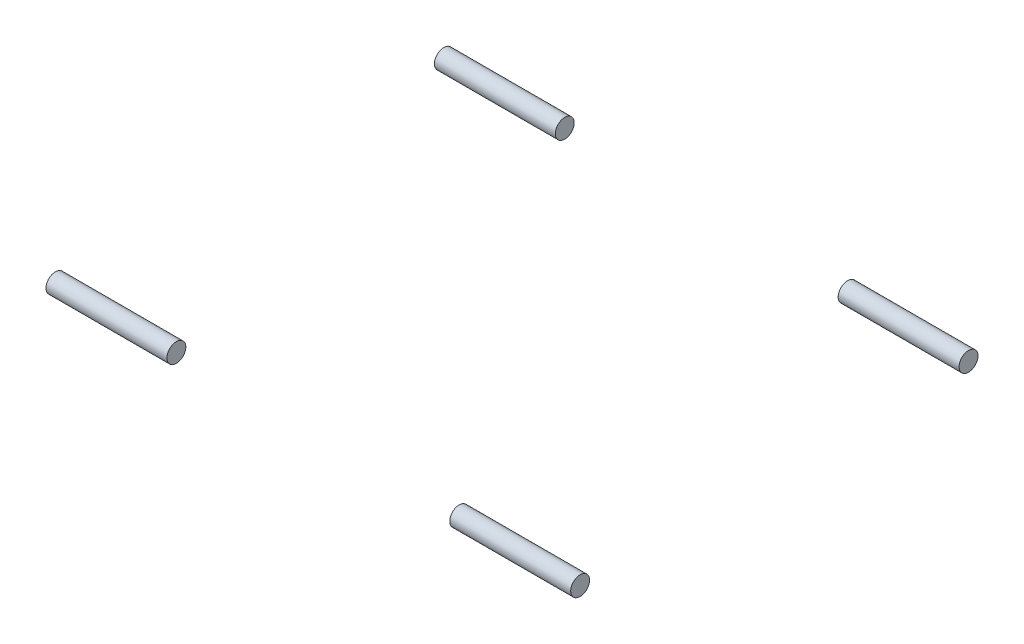
ISO-10303-21;
HEADER;
FILE_DESCRIPTION(('STEP AP214'),'2;1');
FILE_NAME('part.step','',(''),(''),'','','');
FILE_SCHEMA(('AUTOMOTIVE_DESIGN { 1 0 10303 214 1 1 1 1 }'));
ENDSEC;
DATA;
#1=APPLICATION_CONTEXT('core data for automotive mechanical design processes');
#2=APPLICATION_PROTOCOL_DEFINITION('international standard','automotive_design',2000,#1);
#3=PRODUCT_CONTEXT('',#1,'mechanical');
#4=PRODUCT('Part','Part','',(#3));
#5=PRODUCT_RELATED_PRODUCT_CATEGORY('part','',(#4));
#6=PRODUCT_DEFINITION_FORMATION('','',#4);
#7=PRODUCT_DEFINITION_CONTEXT('part definition',#1,'design');
#8=PRODUCT_DEFINITION('design','',#6,#7);
#9=PRODUCT_DEFINITION_SHAPE('','',#8);
#10=(LENGTH_UNIT() NAMED_UNIT(*) SI_UNIT(.MILLI.,.METRE.));
#11=(NAMED_UNIT(*) PLANE_ANGLE_UNIT() SI_UNIT($,.RADIAN.));
#12=(NAMED_UNIT(*) SI_UNIT($,.STERADIAN.) SOLID_ANGLE_UNIT());
#13=UNCERTAINTY_MEASURE_WITH_UNIT(LENGTH_MEASURE(1.E-05),#10,'distance_accuracy_value','');
#14=(GEOMETRIC_REPRESENTATION_CONTEXT(3) GLOBAL_UNCERTAINTY_ASSIGNED_CONTEXT((#13)) GLOBAL_UNIT_ASSIGNED_CONTEXT((#10,
#11,#12)) REPRESENTATION_CONTEXT('',''));
#15=CARTESIAN_POINT('',(0.,0.,0.));
#16=DIRECTION('',(0.,0.,1.));
#17=DIRECTION('',(1.,0.,0.));
#18=AXIS2_PLACEMENT_3D('',#15,#16,#17);
#19=CARTESIAN_POINT('',(-88.1500000000001,0.,0.));
#20=DIRECTION('',(1.,0.,0.));
#21=DIRECTION('',(0.,0.,1.));
#22=AXIS2_PLACEMENT_3D('',#19,#20,#21);
#23=PLANE('',#22);
#24=CARTESIAN_POINT('',(-88.1500000000001,0.,0.));
#25=DIRECTION('',(-1.,0.,0.));
#26=DIRECTION('',(0.,0.,1.));
#27=AXIS2_PLACEMENT_3D('',#24,#25,#26);
#28=CIRCLE('',#27,3.175);
#29=CARTESIAN_POINT('',(-88.1500000000001,0.,-3.175));
#30=VERTEX_POINT('',#29);
#31=EDGE_CURVE('E11',#30,#30,#28,.T.);
#32=ORIENTED_EDGE('',*,*,#31,.T.);
#33=EDGE_LOOP('',(#32));
#34=FACE_BOUND('',#33,.T.);
#35=ADVANCED_FACE('F46',(#34),#23,.F.);
#36=CARTESIAN_POINT('',(-38.5297438309309,0.,0.));
#37=DIRECTION('',(-1.,0.,0.));
#38=DIRECTION('',(0.,0.,-1.));
#39=AXIS2_PLACEMENT_3D('',#36,#37,#38);
#40=CYLINDRICAL_SURFACE('',#39,3.175);
#41=CARTESIAN_POINT('',(-47.509999952,0.,0.));
#42=DIRECTION('',(1.,0.,0.));
#43=DIRECTION('',(0.,0.,-1.));
#44=AXIS2_PLACEMENT_3D('',#41,#42,#43);
#45=CIRCLE('',#44,3.175);
#46=CARTESIAN_POINT('',(-47.509999952,0.,-3.175));
#47=VERTEX_POINT('',#46);
#48=EDGE_CURVE('E50',#47,#47,#45,.F.);
#49=CARTESIAN_POINT('',(-47.509999952,0.,-3.175));
#50=CARTESIAN_POINT('',(-47.9333332858334,0.,-3.175));
#51=CARTESIAN_POINT('',(-48.3566666196667,0.,-3.175));
#52=CARTESIAN_POINT('',(-49.2033332873334,0.,-3.175));
#53=CARTESIAN_POINT('',(-49.6266666211667,0.,-3.175));
#54=CARTESIAN_POINT('',(-50.4733332888334,0.,-3.175));
#55=CARTESIAN_POINT('',(-50.8966666226667,0.,-3.175));
#56=CARTESIAN_POINT('',(-51.7433332903334,0.,-3.175));
#57=CARTESIAN_POINT('',(-52.1666666241667,0.,-3.175));
#58=CARTESIAN_POINT('',(-53.0133332918334,0.,-3.175));
#59=CARTESIAN_POINT('',(-53.4366666256667,0.,-3.175));
#60=CARTESIAN_POINT('',(-54.2833332933334,0.,-3.175));
#61=CARTESIAN_POINT('',(-54.7066666271667,0.,-3.175));
#62=CARTESIAN_POINT('',(-55.5533332948334,0.,-3.175));
#63=CARTESIAN_POINT('',(-55.9766666286667,0.,-3.175));
#64=CARTESIAN_POINT('',(-56.8233332963334,0.,-3.175));
#65=CARTESIAN_POINT('',(-57.2466666301667,0.,-3.175));
#66=CARTESIAN_POINT('',(-58.0933332978334,0.,-3.175));
#67=CARTESIAN_POINT('',(-58.5166666316667,0.,-3.175));
#68=CARTESIAN_POINT('',(-59.3633332993334,0.,-3.175));
#69=CARTESIAN_POINT('',(-59.7866666331667,0.,-3.175));
#70=CARTESIAN_POINT('',(-60.6333333008334,0.,-3.175));
#71=CARTESIAN_POINT('',(-61.0566666346667,0.,-3.175));
#72=CARTESIAN_POINT('',(-61.9033333023334,0.,-3.175));
#73=CARTESIAN_POINT('',(-62.3266666361667,0.,-3.175));
#74=CARTESIAN_POINT('',(-63.1733333038334,0.,-3.175));
#75=CARTESIAN_POINT('',(-63.5966666376668,0.,-3.175));
#76=CARTESIAN_POINT('',(-64.4433333053334,0.,-3.175));
#77=CARTESIAN_POINT('',(-64.8666666391668,0.,-3.175));
#78=CARTESIAN_POINT('',(-65.7133333068334,0.,-3.175));
#79=CARTESIAN_POINT('',(-66.1366666406667,0.,-3.175));
#80=CARTESIAN_POINT('',(-66.9833333083334,0.,-3.175));
#81=CARTESIAN_POINT('',(-67.4066666421668,0.,-3.175));
#82=CARTESIAN_POINT('',(-68.2533333098334,0.,-3.175));
#83=CARTESIAN_POINT('',(-68.6766666436667,0.,-3.175));
#84=CARTESIAN_POINT('',(-69.5233333113334,0.,-3.175));
#85=CARTESIAN_POINT('',(-69.9466666451668,0.,-3.175));
#86=CARTESIAN_POINT('',(-70.7933333128334,0.,-3.175));
#87=CARTESIAN_POINT('',(-71.2166666466668,0.,-3.175));
#88=CARTESIAN_POINT('',(-72.0633333143334,0.,-3.175));
#89=CARTESIAN_POINT('',(-72.4866666481668,0.,-3.175));
#90=CARTESIAN_POINT('',(-73.3333333158334,0.,-3.175));
#91=CARTESIAN_POINT('',(-73.7566666496668,0.,-3.175));
#92=CARTESIAN_POINT('',(-74.6033333173335,0.,-3.175));
#93=CARTESIAN_POINT('',(-75.0266666511668,0.,-3.175));
#94=CARTESIAN_POINT('',(-75.8733333188334,0.,-3.175));
#95=CARTESIAN_POINT('',(-76.2966666526668,0.,-3.175));
#96=CARTESIAN_POINT('',(-77.1433333203335,0.,-3.175));
#97=CARTESIAN_POINT('',(-77.5666666541668,0.,-3.175));
#98=CARTESIAN_POINT('',(-78.4133333218334,0.,-3.175));
#99=CARTESIAN_POINT('',(-78.8366666556668,0.,-3.175));
#100=CARTESIAN_POINT('',(-79.6833333233335,0.,-3.175));
#101=CARTESIAN_POINT('',(-80.1066666571668,0.,-3.175));
#102=CARTESIAN_POINT('',(-80.9533333248335,0.,-3.175));
#103=CARTESIAN_POINT('',(-81.3766666586668,0.,-3.175));
#104=CARTESIAN_POINT('',(-82.2233333263335,0.,-3.175));
#105=CARTESIAN_POINT('',(-82.6466666601668,0.,-3.175));
#106=CARTESIAN_POINT('',(-83.4933333278335,0.,-3.175));
#107=CARTESIAN_POINT('',(-83.9166666616668,0.,-3.175));
#108=CARTESIAN_POINT('',(-84.7633333293335,0.,-3.175));
#109=CARTESIAN_POINT('',(-85.1866666631668,0.,-3.175));
#110=CARTESIAN_POINT('',(-86.0333333308335,0.,-3.175));
#111=CARTESIAN_POINT('',(-86.4566666646668,0.,-3.175));
#112=CARTESIAN_POINT('',(-87.3033333323335,0.,-3.175));
#113=CARTESIAN_POINT('',(-87.7266666661668,0.,-3.175));
#114=CARTESIAN_POINT('',(-88.1500000000001,0.,-3.175));
#115=B_SPLINE_CURVE_WITH_KNOTS('',3,(#49,#50,#51,#52,#53,#54,#55,#56,#57,#58,#59,#60,#61,#62,
#63,#64,#65,#66,#67,#68,#69,#70,#71,#72,#73,#74,#75,#76,#77,#78,#79,#80,#81,#82,#83,#84,#85,#86,
#87,#88,#89,#90,#91,#92,#93,#94,#95,#96,#97,#98,#99,#100,#101,#102,#103,#104,#105,#106,#107,
#108,#109,#110,#111,#112,#113,#114),.UNSPECIFIED.,.F.,.F.,(4,2,2,2,2,2,2,2,2,2,2,2,2,2,2,2,2,2,
2,2,2,2,2,2,2,2,2,2,2,2,2,2,4),(0.,1.2700000015,2.540000003,3.81000000450001,5.08000000600001,
6.35000000750002,7.62000000900002,8.89000001050002,10.160000012,11.4300000135,12.700000015,
13.9700000165,15.240000018,16.5100000195,17.780000021,19.0500000225,20.320000024,21.5900000255,
22.8600000270001,24.1300000285001,25.4000000300001,26.6700000315001,27.9400000330001,
29.2100000345001,30.4800000360001,31.7500000375001,33.0200000390001,34.2900000405001,
35.5600000420001,36.8300000435001,38.1000000450001,39.3700000465001,40.6400000480001),.UNSPECIFIED.);
#116=EDGE_CURVE('BSEAM59',#47,#30,#115,.T.);
#117=ORIENTED_EDGE('',*,*,#48,.T.);
#118=ORIENTED_EDGE('',*,*,#31,.F.);
#119=ORIENTED_EDGE('',*,*,#116,.T.);
#120=ORIENTED_EDGE('',*,*,#116,.F.);
#121=EDGE_LOOP('',(#117,#119,#118,#120));
#122=FACE_BOUND('',#121,.T.);
#123=ADVANCED_FACE('F59',(#122),#40,.T.);
#124=CARTESIAN_POINT('',(-47.509999952,-0.374334859935183,310.945070477779));
#125=DIRECTION('',(-1.,0.,0.));
#126=DIRECTION('',(0.,0.,-1.));
#127=AXIS2_PLACEMENT_3D('',#124,#125,#126);
#128=PLANE('',#127);
#129=ORIENTED_EDGE('',*,*,#48,.F.);
#130=EDGE_LOOP('',(#129));
#131=FACE_BOUND('',#130,.T.);
#132=ADVANCED_FACE('F48',(#131),#128,.F.);
#133=CLOSED_SHELL('',(#35,#123,#132));
#134=MANIFOLD_SOLID_BREP('B2',#133);
#135=CARTESIAN_POINT('',(-88.1500000000001,0.,130.499998656));
#136=DIRECTION('',(1.,0.,0.));
#137=DIRECTION('',(0.,0.,1.));
#138=AXIS2_PLACEMENT_3D('',#135,#136,#137);
#139=PLANE('',#138);
#140=CARTESIAN_POINT('',(-88.1500000000001,0.,130.499998656));
#141=DIRECTION('',(-1.,0.,0.));
#142=DIRECTION('',(0.,0.,1.));
#143=AXIS2_PLACEMENT_3D('',#140,#141,#142);
#144=CIRCLE('',#143,3.175);
#145=CARTESIAN_POINT('',(-88.1500000000001,0.,127.324998656));
#146=VERTEX_POINT('',#145);
#147=EDGE_CURVE('E108',#146,#146,#144,.T.);
#148=ORIENTED_EDGE('',*,*,#147,.T.);
#149=EDGE_LOOP('',(#148));
#150=FACE_BOUND('',#149,.T.);
#151=ADVANCED_FACE('F101',(#150),#139,.F.);
#152=CARTESIAN_POINT('',(-38.5297438309309,0.,130.499998656));
#153=DIRECTION('',(-1.,0.,0.));
#154=DIRECTION('',(0.,0.,-1.));
#155=AXIS2_PLACEMENT_3D('',#152,#153,#154);
#156=CYLINDRICAL_SURFACE('',#155,3.175);
#157=CARTESIAN_POINT('',(-47.509999952,0.,130.499998656));
#158=DIRECTION('',(1.,0.,0.));
#159=DIRECTION('',(0.,0.,-1.));
#160=AXIS2_PLACEMENT_3D('',#157,#158,#159);
#161=CIRCLE('',#160,3.175);
#162=CARTESIAN_POINT('',(-47.509999952,0.,127.324998656));
#163=VERTEX_POINT('',#162);
#164=EDGE_CURVE('E45',#163,#163,#161,.T.);
#165=CARTESIAN_POINT('',(-47.509999952,0.,127.324998656));
#166=CARTESIAN_POINT('',(-47.9333332858334,0.,127.324998656));
#167=CARTESIAN_POINT('',(-48.3566666196667,0.,127.324998656));
#168=CARTESIAN_POINT('',(-49.2033332873334,0.,127.324998656));
#169=CARTESIAN_POINT('',(-49.6266666211667,0.,127.324998656));
#170=CARTESIAN_POINT('',(-50.4733332888334,0.,127.324998656));
#171=CARTESIAN_POINT('',(-50.8966666226667,0.,127.324998656));
#172=CARTESIAN_POINT('',(-51.7433332903334,0.,127.324998656));
#173=CARTESIAN_POINT('',(-52.1666666241667,0.,127.324998656));
#174=CARTESIAN_POINT('',(-53.0133332918334,0.,127.324998656));
#175=CARTESIAN_POINT('',(-53.4366666256667,0.,127.324998656));
#176=CARTESIAN_POINT('',(-54.2833332933334,0.,127.324998656));
#177=CARTESIAN_POINT('',(-54.7066666271667,0.,127.324998656));
#178=CARTESIAN_POINT('',(-55.5533332948334,0.,127.324998656));
#179=CARTESIAN_POINT('',(-55.9766666286667,0.,127.324998656));
#180=CARTESIAN_POINT('',(-56.8233332963334,0.,127.324998656));
#181=CARTESIAN_POINT('',(-57.2466666301667,0.,127.324998656));
#182=CARTESIAN_POINT('',(-58.0933332978334,0.,127.324998656));
#183=CARTESIAN_POINT('',(-58.5166666316667,0.,127.324998656));
#184=CARTESIAN_POINT('',(-59.3633332993334,0.,127.324998656));
#185=CARTESIAN_POINT('',(-59.7866666331667,0.,127.324998656));
#186=CARTESIAN_POINT('',(-60.6333333008334,0.,127.324998656));
#187=CARTESIAN_POINT('',(-61.0566666346667,0.,127.324998656));
#188=CARTESIAN_POINT('',(-61.9033333023334,0.,127.324998656));
#189=CARTESIAN_POINT('',(-62.3266666361667,0.,127.324998656));
#190=CARTESIAN_POINT('',(-63.1733333038334,0.,127.324998656));
#191=CARTESIAN_POINT('',(-63.5966666376668,0.,127.324998656));
#192=CARTESIAN_POINT('',(-64.4433333053334,0.,127.324998656));
#193=CARTESIAN_POINT('',(-64.8666666391668,0.,127.324998656));
#194=CARTESIAN_POINT('',(-65.7133333068334,0.,127.324998656));
#195=CARTESIAN_POINT('',(-66.1366666406667,0.,127.324998656));
#196=CARTESIAN_POINT('',(-66.9833333083334,0.,127.324998656));
#197=CARTESIAN_POINT('',(-67.4066666421668,0.,127.324998656));
#198=CARTESIAN_POINT('',(-68.2533333098334,0.,127.324998656));
#199=CARTESIAN_POINT('',(-68.6766666436667,0.,127.324998656));
#200=CARTESIAN_POINT('',(-69.5233333113334,0.,127.324998656));
#201=CARTESIAN_POINT('',(-69.9466666451668,0.,127.324998656));
#202=CARTESIAN_POINT('',(-70.7933333128334,0.,127.324998656));
#203=CARTESIAN_POINT('',(-71.2166666466668,0.,127.324998656));
#204=CARTESIAN_POINT('',(-72.0633333143334,0.,127.324998656));
#205=CARTESIAN_POINT('',(-72.4866666481668,0.,127.324998656));
#206=CARTESIAN_POINT('',(-73.3333333158334,0.,127.324998656));
#207=CARTESIAN_POINT('',(-73.7566666496668,0.,127.324998656));
#208=CARTESIAN_POINT('',(-74.6033333173335,0.,127.324998656));
#209=CARTESIAN_POINT('',(-75.0266666511668,0.,127.324998656));
#210=CARTESIAN_POINT('',(-75.8733333188334,0.,127.324998656));
#211=CARTESIAN_POINT('',(-76.2966666526668,0.,127.324998656));
#212=CARTESIAN_POINT('',(-77.1433333203335,0.,127.324998656));
#213=CARTESIAN_POINT('',(-77.5666666541668,0.,127.324998656));
#214=CARTESIAN_POINT('',(-78.4133333218334,0.,127.324998656));
#215=CARTESIAN_POINT('',(-78.8366666556668,0.,127.324998656));
#216=CARTESIAN_POINT('',(-79.6833333233335,0.,127.324998656));
#217=CARTESIAN_POINT('',(-80.1066666571668,0.,127.324998656));
#218=CARTESIAN_POINT('',(-80.9533333248335,0.,127.324998656));
#219=CARTESIAN_POINT('',(-81.3766666586668,0.,127.324998656));
#220=CARTESIAN_POINT('',(-82.2233333263335,0.,127.324998656));
#221=CARTESIAN_POINT('',(-82.6466666601668,0.,127.324998656));
#222=CARTESIAN_POINT('',(-83.4933333278335,0.,127.324998656));
#223=CARTESIAN_POINT('',(-83.9166666616668,0.,127.324998656));
#224=CARTESIAN_POINT('',(-84.7633333293335,0.,127.324998656));
#225=CARTESIAN_POINT('',(-85.1866666631668,0.,127.324998656));
#226=CARTESIAN_POINT('',(-86.0333333308335,0.,127.324998656));
#227=CARTESIAN_POINT('',(-86.4566666646668,0.,127.324998656));
#228=CARTESIAN_POINT('',(-87.3033333323335,0.,127.324998656));
#229=CARTESIAN_POINT('',(-87.7266666661668,0.,127.324998656));
#230=CARTESIAN_POINT('',(-88.1500000000001,0.,127.324998656));
#231=B_SPLINE_CURVE_WITH_KNOTS('',3,(#165,#166,#167,#168,#169,#170,#171,#172,#173,#174,#175,
#176,#177,#178,#179,#180,#181,#182,#183,#184,#185,#186,#187,#188,#189,#190,#191,#192,#193,#194,
#195,#196,#197,#198,#199,#200,#201,#202,#203,#204,#205,#206,#207,#208,#209,#210,#211,#212,#213,
#214,#215,#216,#217,#218,#219,#220,#221,#222,#223,#224,#225,#226,#227,#228,#229,#230),
.UNSPECIFIED.,.F.,.F.,(4,2,2,2,2,2,2,2,2,2,2,2,2,2,2,2,2,2,2,2,2,2,2,2,2,2,2,2,2,2,2,2,4),(0.,
1.2700000015,2.540000003,3.81000000450001,5.08000000600001,6.35000000750002,7.62000000900002,
8.89000001050002,10.160000012,11.4300000135,12.700000015,13.9700000165,15.240000018,
16.5100000195,17.780000021,19.0500000225,20.320000024,21.5900000255,22.8600000270001,
24.1300000285001,25.4000000300001,26.6700000315001,27.9400000330001,29.2100000345001,
30.4800000360001,31.7500000375001,33.0200000390001,34.2900000405001,35.5600000420001,
36.8300000435001,38.1000000450001,39.3700000465001,40.6400000480001),.UNSPECIFIED.);
#232=EDGE_CURVE('BSEAM103',#163,#146,#231,.T.);
#233=ORIENTED_EDGE('',*,*,#164,.F.);
#234=ORIENTED_EDGE('',*,*,#147,.F.);
#235=ORIENTED_EDGE('',*,*,#232,.T.);
#236=ORIENTED_EDGE('',*,*,#232,.F.);
#237=EDGE_LOOP('',(#233,#235,#234,#236));
#238=FACE_BOUND('',#237,.T.);
#239=ADVANCED_FACE('F103',(#238),#156,.T.);
#240=CARTESIAN_POINT('',(-47.509999952,-0.374334859935183,310.945070477779));
#241=DIRECTION('',(-1.,0.,0.));
#242=DIRECTION('',(0.,0.,-1.));
#243=AXIS2_PLACEMENT_3D('',#240,#241,#242);
#244=PLANE('',#243);
#245=ORIENTED_EDGE('',*,*,#164,.T.);
#246=EDGE_LOOP('',(#245));
#247=FACE_BOUND('',#246,.T.);
#248=ADVANCED_FACE('F116',(#247),#244,.F.);
#249=CLOSED_SHELL('',(#151,#239,#248));
#250=MANIFOLD_SOLID_BREP('B6',#249);
#251=CARTESIAN_POINT('',(88.1500000000001,0.,0.));
#252=DIRECTION('',(-1.,0.,0.));
#253=DIRECTION('',(0.,0.,1.));
#254=AXIS2_PLACEMENT_3D('',#251,#252,#253);
#255=PLANE('',#254);
#256=CARTESIAN_POINT('',(88.1500000000001,0.,0.));
#257=DIRECTION('',(-1.,0.,0.));
#258=DIRECTION('',(0.,0.,1.));
#259=AXIS2_PLACEMENT_3D('',#256,#257,#258);
#260=CIRCLE('',#259,3.175);
#261=CARTESIAN_POINT('',(88.1500000000001,0.,-3.175));
#262=VERTEX_POINT('',#261);
#263=EDGE_CURVE('E100',#262,#262,#260,.T.);
#264=ORIENTED_EDGE('',*,*,#263,.F.);
#265=EDGE_LOOP('',(#264));
#266=FACE_BOUND('',#265,.T.);
#267=ADVANCED_FACE('F155',(#266),#255,.F.);
#268=CARTESIAN_POINT('',(38.5297438309309,0.,0.));
#269=DIRECTION('',(1.,0.,0.));
#270=DIRECTION('',(0.,0.,-1.));
#271=AXIS2_PLACEMENT_3D('',#268,#269,#270);
#272=CYLINDRICAL_SURFACE('',#271,3.175);
#273=CARTESIAN_POINT('',(47.509999952,0.,0.));
#274=DIRECTION('',(1.,0.,0.));
#275=DIRECTION('',(0.,0.,-1.));
#276=AXIS2_PLACEMENT_3D('',#273,#274,#275);
#277=CIRCLE('',#276,3.175);
#278=CARTESIAN_POINT('',(47.509999952,0.,-3.175));
#279=VERTEX_POINT('',#278);
#280=EDGE_CURVE('E159',#279,#279,#277,.F.);
#281=CARTESIAN_POINT('',(47.509999952,0.,-3.175));
#282=CARTESIAN_POINT('',(47.9333332858334,0.,-3.175));
#283=CARTESIAN_POINT('',(48.3566666196667,0.,-3.175));
#284=CARTESIAN_POINT('',(49.2033332873334,0.,-3.175));
#285=CARTESIAN_POINT('',(49.6266666211667,0.,-3.175));
#286=CARTESIAN_POINT('',(50.4733332888334,0.,-3.175));
#287=CARTESIAN_POINT('',(50.8966666226667,0.,-3.175));
#288=CARTESIAN_POINT('',(51.7433332903334,0.,-3.175));
#289=CARTESIAN_POINT('',(52.1666666241667,0.,-3.175));
#290=CARTESIAN_POINT('',(53.0133332918334,0.,-3.175));
#291=CARTESIAN_POINT('',(53.4366666256667,0.,-3.175));
#292=CARTESIAN_POINT('',(54.2833332933334,0.,-3.175));
#293=CARTESIAN_POINT('',(54.7066666271667,0.,-3.175));
#294=CARTESIAN_POINT('',(55.5533332948334,0.,-3.175));
#295=CARTESIAN_POINT('',(55.9766666286667,0.,-3.175));
#296=CARTESIAN_POINT('',(56.8233332963334,0.,-3.175));
#297=CARTESIAN_POINT('',(57.2466666301667,0.,-3.175));
#298=CARTESIAN_POINT('',(58.0933332978334,0.,-3.175));
#299=CARTESIAN_POINT('',(58.5166666316667,0.,-3.175));
#300=CARTESIAN_POINT('',(59.3633332993334,0.,-3.175));
#301=CARTESIAN_POINT('',(59.7866666331667,0.,-3.175));
#302=CARTESIAN_POINT('',(60.6333333008334,0.,-3.175));
#303=CARTESIAN_POINT('',(61.0566666346667,0.,-3.175));
#304=CARTESIAN_POINT('',(61.9033333023334,0.,-3.175));
#305=CARTESIAN_POINT('',(62.3266666361667,0.,-3.175));
#306=CARTESIAN_POINT('',(63.1733333038334,0.,-3.175));
#307=CARTESIAN_POINT('',(63.5966666376667,0.,-3.175));
#308=CARTESIAN_POINT('',(64.4433333053334,0.,-3.175));
#309=CARTESIAN_POINT('',(64.8666666391668,0.,-3.175));
#310=CARTESIAN_POINT('',(65.7133333068334,0.,-3.175));
#311=CARTESIAN_POINT('',(66.1366666406667,0.,-3.175));
#312=CARTESIAN_POINT('',(66.9833333083334,0.,-3.175));
#313=CARTESIAN_POINT('',(67.4066666421668,0.,-3.175));
#314=CARTESIAN_POINT('',(68.2533333098334,0.,-3.175));
#315=CARTESIAN_POINT('',(68.6766666436667,0.,-3.175));
#316=CARTESIAN_POINT('',(69.5233333113334,0.,-3.175));
#317=CARTESIAN_POINT('',(69.9466666451668,0.,-3.175));
#318=CARTESIAN_POINT('',(70.7933333128334,0.,-3.175));
#319=CARTESIAN_POINT('',(71.2166666466668,0.,-3.175));
#320=CARTESIAN_POINT('',(72.0633333143334,0.,-3.175));
#321=CARTESIAN_POINT('',(72.4866666481668,0.,-3.175));
#322=CARTESIAN_POINT('',(73.3333333158334,0.,-3.175));
#323=CARTESIAN_POINT('',(73.7566666496668,0.,-3.175));
#324=CARTESIAN_POINT('',(74.6033333173335,0.,-3.175));
#325=CARTESIAN_POINT('',(75.0266666511668,0.,-3.175));
#326=CARTESIAN_POINT('',(75.8733333188334,0.,-3.175));
#327=CARTESIAN_POINT('',(76.2966666526668,0.,-3.175));
#328=CARTESIAN_POINT('',(77.1433333203335,0.,-3.175));
#329=CARTESIAN_POINT('',(77.5666666541668,0.,-3.175));
#330=CARTESIAN_POINT('',(78.4133333218334,0.,-3.175));
#331=CARTESIAN_POINT('',(78.8366666556668,0.,-3.175));
#332=CARTESIAN_POINT('',(79.6833333233335,0.,-3.175));
#333=CARTESIAN_POINT('',(80.1066666571668,0.,-3.175));
#334=CARTESIAN_POINT('',(80.9533333248335,0.,-3.175));
#335=CARTESIAN_POINT('',(81.3766666586668,0.,-3.175));
#336=CARTESIAN_POINT('',(82.2233333263335,0.,-3.175));
#337=CARTESIAN_POINT('',(82.6466666601668,0.,-3.175));
#338=CARTESIAN_POINT('',(83.4933333278335,0.,-3.175));
#339=CARTESIAN_POINT('',(83.9166666616668,0.,-3.175));
#340=CARTESIAN_POINT('',(84.7633333293335,0.,-3.175));
#341=CARTESIAN_POINT('',(85.1866666631668,0.,-3.175));
#342=CARTESIAN_POINT('',(86.0333333308335,0.,-3.175));
#343=CARTESIAN_POINT('',(86.4566666646668,0.,-3.175));
#344=CARTESIAN_POINT('',(87.3033333323335,0.,-3.175));
#345=CARTESIAN_POINT('',(87.7266666661668,0.,-3.175));
#346=CARTESIAN_POINT('',(88.1500000000001,0.,-3.175));
#347=B_SPLINE_CURVE_WITH_KNOTS('',3,(#281,#282,#283,#284,#285,#286,#287,#288,#289,#290,#291,
#292,#293,#294,#295,#296,#297,#298,#299,#300,#301,#302,#303,#304,#305,#306,#307,#308,#309,#310,
#311,#312,#313,#314,#315,#316,#317,#318,#319,#320,#321,#322,#323,#324,#325,#326,#327,#328,#329,
#330,#331,#332,#333,#334,#335,#336,#337,#338,#339,#340,#341,#342,#343,#344,#345,#346),
.UNSPECIFIED.,.F.,.F.,(4,2,2,2,2,2,2,2,2,2,2,2,2,2,2,2,2,2,2,2,2,2,2,2,2,2,2,2,2,2,2,2,4),(0.,
1.27000000150001,2.54000000300001,3.81000000450001,5.08000000600001,6.35000000750002,
7.62000000900002,8.89000001050003,10.160000012,11.4300000135,12.700000015,13.9700000165,
15.240000018,16.5100000195,17.7800000210001,19.0500000225001,20.3200000240001,21.5900000255001,
22.8600000270001,24.1300000285001,25.4000000300001,26.6700000315001,27.9400000330001,
29.2100000345001,30.4800000360001,31.7500000375001,33.0200000390001,34.2900000405001,
35.5600000420001,36.8300000435001,38.1000000450001,39.3700000465001,40.6400000480001),.UNSPECIFIED.);
#348=EDGE_CURVE('BSEAM169',#279,#262,#347,.T.);
#349=ORIENTED_EDGE('',*,*,#280,.F.);
#350=ORIENTED_EDGE('',*,*,#263,.T.);
#351=ORIENTED_EDGE('',*,*,#348,.T.);
#352=ORIENTED_EDGE('',*,*,#348,.F.);
#353=EDGE_LOOP('',(#349,#351,#350,#352));
#354=FACE_BOUND('',#353,.T.);
#355=ADVANCED_FACE('F169',(#354),#272,.T.);
#356=CARTESIAN_POINT('',(47.509999952,-0.374334859935183,310.945070477779));
#357=DIRECTION('',(1.,0.,0.));
#358=DIRECTION('',(0.,0.,-1.));
#359=AXIS2_PLACEMENT_3D('',#356,#357,#358);
#360=PLANE('',#359);
#361=ORIENTED_EDGE('',*,*,#280,.T.);
#362=EDGE_LOOP('',(#361));
#363=FACE_BOUND('',#362,.T.);
#364=ADVANCED_FACE('F157',(#363),#360,.F.);
#365=CLOSED_SHELL('',(#267,#355,#364));
#366=MANIFOLD_SOLID_BREP('B40',#365);
#367=CARTESIAN_POINT('',(88.1500000000001,0.,130.499998656));
#368=DIRECTION('',(-1.,0.,0.));
#369=DIRECTION('',(0.,0.,1.));
#370=AXIS2_PLACEMENT_3D('',#367,#368,#369);
#371=PLANE('',#370);
#372=CARTESIAN_POINT('',(88.1500000000001,0.,130.499998656));
#373=DIRECTION('',(-1.,0.,0.));
#374=DIRECTION('',(0.,0.,1.));
#375=AXIS2_PLACEMENT_3D('',#372,#373,#374);
#376=CIRCLE('',#375,3.175);
#377=CARTESIAN_POINT('',(88.1500000000001,0.,127.324998656));
#378=VERTEX_POINT('',#377);
#379=EDGE_CURVE('E209',#378,#378,#376,.T.);
#380=ORIENTED_EDGE('',*,*,#379,.F.);
#381=EDGE_LOOP('',(#380));
#382=FACE_BOUND('',#381,.T.);
#383=ADVANCED_FACE('F202',(#382),#371,.F.);
#384=CARTESIAN_POINT('',(38.5297438309309,0.,130.499998656));
#385=DIRECTION('',(1.,0.,0.));
#386=DIRECTION('',(0.,0.,-1.));
#387=AXIS2_PLACEMENT_3D('',#384,#385,#386);
#388=CYLINDRICAL_SURFACE('',#387,3.175);
#389=CARTESIAN_POINT('',(47.509999952,0.,130.499998656));
#390=DIRECTION('',(1.,0.,0.));
#391=DIRECTION('',(0.,0.,-1.));
#392=AXIS2_PLACEMENT_3D('',#389,#390,#391);
#393=CIRCLE('',#392,3.175);
#394=CARTESIAN_POINT('',(47.509999952,0.,127.324998656));
#395=VERTEX_POINT('',#394);
#396=EDGE_CURVE('E154',#395,#395,#393,.T.);
#397=CARTESIAN_POINT('',(47.509999952,0.,127.324998656));
#398=CARTESIAN_POINT('',(47.9333332858334,0.,127.324998656));
#399=CARTESIAN_POINT('',(48.3566666196667,0.,127.324998656));
#400=CARTESIAN_POINT('',(49.2033332873334,0.,127.324998656));
#401=CARTESIAN_POINT('',(49.6266666211667,0.,127.324998656));
#402=CARTESIAN_POINT('',(50.4733332888334,0.,127.324998656));
#403=CARTESIAN_POINT('',(50.8966666226667,0.,127.324998656));
#404=CARTESIAN_POINT('',(51.7433332903334,0.,127.324998656));
#405=CARTESIAN_POINT('',(52.1666666241667,0.,127.324998656));
#406=CARTESIAN_POINT('',(53.0133332918334,0.,127.324998656));
#407=CARTESIAN_POINT('',(53.4366666256667,0.,127.324998656));
#408=CARTESIAN_POINT('',(54.2833332933334,0.,127.324998656));
#409=CARTESIAN_POINT('',(54.7066666271667,0.,127.324998656));
#410=CARTESIAN_POINT('',(55.5533332948334,0.,127.324998656));
#411=CARTESIAN_POINT('',(55.9766666286667,0.,127.324998656));
#412=CARTESIAN_POINT('',(56.8233332963334,0.,127.324998656));
#413=CARTESIAN_POINT('',(57.2466666301667,0.,127.324998656));
#414=CARTESIAN_POINT('',(58.0933332978334,0.,127.324998656));
#415=CARTESIAN_POINT('',(58.5166666316667,0.,127.324998656));
#416=CARTESIAN_POINT('',(59.3633332993334,0.,127.324998656));
#417=CARTESIAN_POINT('',(59.7866666331667,0.,127.324998656));
#418=CARTESIAN_POINT('',(60.6333333008334,0.,127.324998656));
#419=CARTESIAN_POINT('',(61.0566666346667,0.,127.324998656));
#420=CARTESIAN_POINT('',(61.9033333023334,0.,127.324998656));
#421=CARTESIAN_POINT('',(62.3266666361667,0.,127.324998656));
#422=CARTESIAN_POINT('',(63.1733333038334,0.,127.324998656));
#423=CARTESIAN_POINT('',(63.5966666376667,0.,127.324998656));
#424=CARTESIAN_POINT('',(64.4433333053334,0.,127.324998656));
#425=CARTESIAN_POINT('',(64.8666666391668,0.,127.324998656));
#426=CARTESIAN_POINT('',(65.7133333068334,0.,127.324998656));
#427=CARTESIAN_POINT('',(66.1366666406667,0.,127.324998656));
#428=CARTESIAN_POINT('',(66.9833333083334,0.,127.324998656));
#429=CARTESIAN_POINT('',(67.4066666421668,0.,127.324998656));
#430=CARTESIAN_POINT('',(68.2533333098334,0.,127.324998656));
#431=CARTESIAN_POINT('',(68.6766666436667,0.,127.324998656));
#432=CARTESIAN_POINT('',(69.5233333113334,0.,127.324998656));
#433=CARTESIAN_POINT('',(69.9466666451668,0.,127.324998656));
#434=CARTESIAN_POINT('',(70.7933333128334,0.,127.324998656));
#435=CARTESIAN_POINT('',(71.2166666466668,0.,127.324998656));
#436=CARTESIAN_POINT('',(72.0633333143334,0.,127.324998656));
#437=CARTESIAN_POINT('',(72.4866666481668,0.,127.324998656));
#438=CARTESIAN_POINT('',(73.3333333158334,0.,127.324998656));
#439=CARTESIAN_POINT('',(73.7566666496668,0.,127.324998656));
#440=CARTESIAN_POINT('',(74.6033333173335,0.,127.324998656));
#441=CARTESIAN_POINT('',(75.0266666511668,0.,127.324998656));
#442=CARTESIAN_POINT('',(75.8733333188334,0.,127.324998656));
#443=CARTESIAN_POINT('',(76.2966666526668,0.,127.324998656));
#444=CARTESIAN_POINT('',(77.1433333203335,0.,127.324998656));
#445=CARTESIAN_POINT('',(77.5666666541668,0.,127.324998656));
#446=CARTESIAN_POINT('',(78.4133333218334,0.,127.324998656));
#447=CARTESIAN_POINT('',(78.8366666556668,0.,127.324998656));
#448=CARTESIAN_POINT('',(79.6833333233335,0.,127.324998656));
#449=CARTESIAN_POINT('',(80.1066666571668,0.,127.324998656));
#450=CARTESIAN_POINT('',(80.9533333248335,0.,127.324998656));
#451=CARTESIAN_POINT('',(81.3766666586668,0.,127.324998656));
#452=CARTESIAN_POINT('',(82.2233333263335,0.,127.324998656));
#453=CARTESIAN_POINT('',(82.6466666601668,0.,127.324998656));
#454=CARTESIAN_POINT('',(83.4933333278335,0.,127.324998656));
#455=CARTESIAN_POINT('',(83.9166666616668,0.,127.324998656));
#456=CARTESIAN_POINT('',(84.7633333293335,0.,127.324998656));
#457=CARTESIAN_POINT('',(85.1866666631668,0.,127.324998656));
#458=CARTESIAN_POINT('',(86.0333333308335,0.,127.324998656));
#459=CARTESIAN_POINT('',(86.4566666646668,0.,127.324998656));
#460=CARTESIAN_POINT('',(87.3033333323335,0.,127.324998656));
#461=CARTESIAN_POINT('',(87.7266666661668,0.,127.324998656));
#462=CARTESIAN_POINT('',(88.1500000000001,0.,127.324998656));
#463=B_SPLINE_CURVE_WITH_KNOTS('',3,(#397,#398,#399,#400,#401,#402,#403,#404,#405,#406,#407,
#408,#409,#410,#411,#412,#413,#414,#415,#416,#417,#418,#419,#420,#421,#422,#423,#424,#425,#426,
#427,#428,#429,#430,#431,#432,#433,#434,#435,#436,#437,#438,#439,#440,#441,#442,#443,#444,#445,
#446,#447,#448,#449,#450,#451,#452,#453,#454,#455,#456,#457,#458,#459,#460,#461,#462),
.UNSPECIFIED.,.F.,.F.,(4,2,2,2,2,2,2,2,2,2,2,2,2,2,2,2,2,2,2,2,2,2,2,2,2,2,2,2,2,2,2,2,4),(0.,
1.27000000150001,2.54000000300001,3.81000000450001,5.08000000600001,6.35000000750002,
7.62000000900002,8.89000001050003,10.160000012,11.4300000135,12.700000015,13.9700000165,
15.240000018,16.5100000195,17.7800000210001,19.0500000225001,20.3200000240001,21.5900000255001,
22.8600000270001,24.1300000285001,25.4000000300001,26.6700000315001,27.9400000330001,
29.2100000345001,30.4800000360001,31.7500000375001,33.0200000390001,34.2900000405001,
35.5600000420001,36.8300000435001,38.1000000450001,39.3700000465001,40.6400000480001),.UNSPECIFIED.);
#464=EDGE_CURVE('BSEAM204',#395,#378,#463,.T.);
#465=ORIENTED_EDGE('',*,*,#396,.T.);
#466=ORIENTED_EDGE('',*,*,#379,.T.);
#467=ORIENTED_EDGE('',*,*,#464,.T.);
#468=ORIENTED_EDGE('',*,*,#464,.F.);
#469=EDGE_LOOP('',(#465,#467,#466,#468));
#470=FACE_BOUND('',#469,.T.);
#471=ADVANCED_FACE('F204',(#470),#388,.T.);
#472=CARTESIAN_POINT('',(47.509999952,-0.374334859935183,310.945070477779));
#473=DIRECTION('',(1.,0.,0.));
#474=DIRECTION('',(0.,0.,-1.));
#475=AXIS2_PLACEMENT_3D('',#472,#473,#474);
#476=PLANE('',#475);
#477=ORIENTED_EDGE('',*,*,#396,.F.);
#478=EDGE_LOOP('',(#477));
#479=FACE_BOUND('',#478,.T.);
#480=ADVANCED_FACE('F220',(#479),#476,.F.);
#481=CLOSED_SHELL('',(#383,#471,#480));
#482=MANIFOLD_SOLID_BREP('B95',#481);
#483=ADVANCED_BREP_SHAPE_REPRESENTATION('',(#18,#134,#250,#366,#482),#14);
#484=SHAPE_DEFINITION_REPRESENTATION(#9,#483);
ENDSEC;
END-ISO-10303-21;
